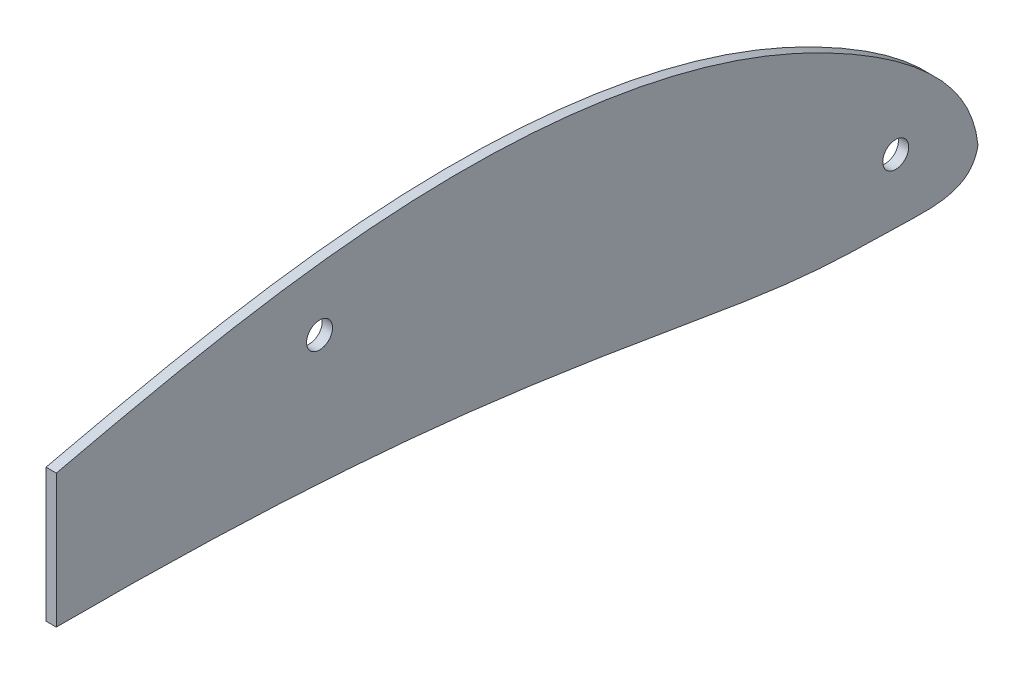
ISO-10303-21;
HEADER;
FILE_DESCRIPTION(('STEP AP214'),'2;1');
FILE_NAME('part.step','',(''),(''),'','','');
FILE_SCHEMA(('AUTOMOTIVE_DESIGN { 1 0 10303 214 1 1 1 1 }'));
ENDSEC;
DATA;
#1=APPLICATION_CONTEXT('core data for automotive mechanical design processes');
#2=APPLICATION_PROTOCOL_DEFINITION('international standard','automotive_design',2000,#1);
#3=PRODUCT_CONTEXT('',#1,'mechanical');
#4=PRODUCT('Part','Part','',(#3));
#5=PRODUCT_RELATED_PRODUCT_CATEGORY('part','',(#4));
#6=PRODUCT_DEFINITION_FORMATION('','',#4);
#7=PRODUCT_DEFINITION_CONTEXT('part definition',#1,'design');
#8=PRODUCT_DEFINITION('design','',#6,#7);
#9=PRODUCT_DEFINITION_SHAPE('','',#8);
#10=(LENGTH_UNIT() NAMED_UNIT(*) SI_UNIT(.MILLI.,.METRE.));
#11=(NAMED_UNIT(*) PLANE_ANGLE_UNIT() SI_UNIT($,.RADIAN.));
#12=(NAMED_UNIT(*) SI_UNIT($,.STERADIAN.) SOLID_ANGLE_UNIT());
#13=UNCERTAINTY_MEASURE_WITH_UNIT(LENGTH_MEASURE(1.E-05),#10,'distance_accuracy_value','');
#14=(GEOMETRIC_REPRESENTATION_CONTEXT(3) GLOBAL_UNCERTAINTY_ASSIGNED_CONTEXT((#13)) GLOBAL_UNIT_ASSIGNED_CONTEXT((#10,
#11,#12)) REPRESENTATION_CONTEXT('',''));
#15=CARTESIAN_POINT('',(0.,0.,0.));
#16=DIRECTION('',(0.,0.,1.));
#17=DIRECTION('',(1.,0.,0.));
#18=AXIS2_PLACEMENT_3D('',#15,#16,#17);
#19=CARTESIAN_POINT('',(-227.0125,249.356885044254,248.601164773977));
#20=DIRECTION('',(1.,0.,0.));
#21=DIRECTION('',(0.,1.,0.));
#22=AXIS2_PLACEMENT_3D('',#19,#20,#21);
#23=PLANE('',#22);
#24=CARTESIAN_POINT('',(-227.0125,10.9757958853986,70.5876602686386));
#25=DIRECTION('',(-1.,0.,0.));
#26=DIRECTION('',(0.,-1.,0.));
#27=AXIS2_PLACEMENT_3D('',#24,#25,#26);
#28=CIRCLE('',#27,2.);
#29=CARTESIAN_POINT('',(-227.0125,8.97579588539862,70.5876602686386));
#30=VERTEX_POINT('',#29);
#31=EDGE_CURVE('E614',#30,#30,#28,.T.);
#32=ORIENTED_EDGE('',*,*,#31,.T.);
#33=EDGE_LOOP('',(#32));
#34=FACE_BOUND('',#33,.T.);
#35=CARTESIAN_POINT('',(-227.0125,31.2957958853986,159.487660268639));
#36=DIRECTION('',(-1.,0.,0.));
#37=DIRECTION('',(0.,-1.,0.));
#38=AXIS2_PLACEMENT_3D('',#35,#36,#37);
#39=CIRCLE('',#38,2.);
#40=CARTESIAN_POINT('',(-227.0125,29.2957958853986,159.487660268639));
#41=VERTEX_POINT('',#40);
#42=EDGE_CURVE('E658',#41,#41,#39,.T.);
#43=ORIENTED_EDGE('',*,*,#42,.T.);
#44=EDGE_LOOP('',(#43));
#45=FACE_BOUND('',#44,.T.);
#46=CARTESIAN_POINT('',(-227.0125,5.89579588539861,57.8876602686386));
#47=CARTESIAN_POINT('',(-227.0125,11.4375298185041,58.4977039922272));
#48=CARTESIAN_POINT('',(-227.0125,19.3424786806868,64.4003558423215));
#49=CARTESIAN_POINT('',(-227.0125,28.468473074538,77.6824198998625));
#50=CARTESIAN_POINT('',(-227.0125,37.5748623123411,97.1285534265328));
#51=CARTESIAN_POINT('',(-227.0125,43.0194934329442,125.362969322304));
#52=CARTESIAN_POINT('',(-227.0125,41.5069186372436,169.207920796175));
#53=CARTESIAN_POINT('',(-227.0125,32.6348292698958,201.329645296342));
#54=CARTESIAN_POINT('',(-227.0125,28.067577517069,222.336628160291));
#55=B_SPLINE_CURVE_WITH_KNOTS('',3,(#46,#47,#48,#49,#50,#51,#52,#53,#54),.UNSPECIFIED.,.F.,.F.,
(4,1,1,1,1,1,4),(0.,0.0865869930935198,0.16173742787457,0.268322265449627,0.445156626621206,
0.638028872876503,1.),.UNSPECIFIED.);
#56=CARTESIAN_POINT('',(-227.0125,5.89579588539861,57.8876602686386));
#57=VERTEX_POINT('',#56);
#58=CARTESIAN_POINT('',(-227.0125,33.1564134447646,200.11162816029));
#59=VERTEX_POINT('',#58);
#60=EDGE_CURVE('E581',#57,#59,#55,.T.);
#61=ORIENTED_EDGE('',*,*,#60,.T.);
#62=DIRECTION('',(0.,-1.,0.));
#63=VECTOR('',#62,1.);
#64=CARTESIAN_POINT('',(-227.0125,-51.562025,200.11162816029));
#65=LINE('',#64,#63);
#66=CARTESIAN_POINT('',(-227.0125,12.5693808530336,200.11162816029));
#67=VERTEX_POINT('',#66);
#68=EDGE_CURVE('E617',#59,#67,#65,.T.);
#69=ORIENTED_EDGE('',*,*,#68,.T.);
#70=CARTESIAN_POINT('',(-227.0125,12.1750725821855,222.336628160268));
#71=CARTESIAN_POINT('',(-227.0125,13.0264646632632,193.680569664148));
#72=CARTESIAN_POINT('',(-227.0125,12.6013501035627,154.402001186683));
#73=CARTESIAN_POINT('',(-227.0125,5.45323272198308,107.967999962241));
#74=CARTESIAN_POINT('',(-227.0125,1.30332527226234,85.3393891083057));
#75=CARTESIAN_POINT('',(-227.0125,1.23503708265966,69.4212938685485));
#76=CARTESIAN_POINT('',(-227.0125,0.681560257657299,58.8140260385803));
#77=CARTESIAN_POINT('',(-227.0125,5.89579588539861,57.8876602686386));
#78=B_SPLINE_CURVE_WITH_KNOTS('',3,(#70,#71,#72,#73,#74,#75,#76,#77),.UNSPECIFIED.,.F.,.F.,(4,1,
1,1,1,4),(0.,0.517329721776624,0.696666541434988,0.84940993817877,0.919519723249622,1.),.UNSPECIFIED.);
#79=EDGE_CURVE('E684',#67,#57,#78,.T.);
#80=ORIENTED_EDGE('',*,*,#79,.T.);
#81=EDGE_LOOP('',(#61,#69,#80));
#82=FACE_BOUND('',#81,.T.);
#83=ADVANCED_FACE('F563',(#34,#45,#82),#23,.T.);
#84=CARTESIAN_POINT('',(-228.6,57.38803834214,248.601164773977));
#85=DIRECTION('',(-1.,0.,0.));
#86=DIRECTION('',(0.,-1.,0.));
#87=AXIS2_PLACEMENT_3D('',#84,#85,#86);
#88=PLANE('',#87);
#89=CARTESIAN_POINT('',(-228.6,10.9757958853986,70.5876602686386));
#90=DIRECTION('',(-1.,0.,0.));
#91=DIRECTION('',(0.,-1.,0.));
#92=AXIS2_PLACEMENT_3D('',#89,#90,#91);
#93=CIRCLE('',#92,2.);
#94=CARTESIAN_POINT('',(-228.6,8.97579588539862,70.5876602686386));
#95=VERTEX_POINT('',#94);
#96=EDGE_CURVE('E656',#95,#95,#93,.T.);
#97=ORIENTED_EDGE('',*,*,#96,.F.);
#98=EDGE_LOOP('',(#97));
#99=FACE_BOUND('',#98,.T.);
#100=CARTESIAN_POINT('',(-228.6,31.2957958853986,159.487660268639));
#101=DIRECTION('',(-1.,0.,0.));
#102=DIRECTION('',(0.,-1.,0.));
#103=AXIS2_PLACEMENT_3D('',#100,#101,#102);
#104=CIRCLE('',#103,2.);
#105=CARTESIAN_POINT('',(-228.6,29.2957958853986,159.487660268639));
#106=VERTEX_POINT('',#105);
#107=EDGE_CURVE('E664',#106,#106,#104,.T.);
#108=ORIENTED_EDGE('',*,*,#107,.F.);
#109=EDGE_LOOP('',(#108));
#110=FACE_BOUND('',#109,.T.);
#111=CARTESIAN_POINT('',(-228.6,12.1750725821855,222.336628160268));
#112=CARTESIAN_POINT('',(-228.6,13.0264646632632,193.680569664148));
#113=CARTESIAN_POINT('',(-228.6,12.6013501035627,154.402001186683));
#114=CARTESIAN_POINT('',(-228.6,5.45323272198308,107.967999962241));
#115=CARTESIAN_POINT('',(-228.6,1.30332527226234,85.3393891083057));
#116=CARTESIAN_POINT('',(-228.6,1.23503708265966,69.4212938685485));
#117=CARTESIAN_POINT('',(-228.6,0.681560257657299,58.8140260385803));
#118=CARTESIAN_POINT('',(-228.6,5.89579588539861,57.8876602686386));
#119=B_SPLINE_CURVE_WITH_KNOTS('',3,(#111,#112,#113,#114,#115,#116,#117,#118),.UNSPECIFIED.,.F.,
.F.,(4,1,1,1,1,4),(0.,0.517329721776624,0.696666541434988,0.84940993817877,0.919519723249622,
1.),.UNSPECIFIED.);
#120=CARTESIAN_POINT('',(-228.6,5.89579588539861,57.8876602686386));
#121=VERTEX_POINT('',#120);
#122=CARTESIAN_POINT('',(-228.6,12.5693808530336,200.11162816029));
#123=VERTEX_POINT('',#122);
#124=EDGE_CURVE('E589',#121,#123,#119,.F.);
#125=ORIENTED_EDGE('',*,*,#124,.T.);
#126=DIRECTION('',(0.,1.,0.));
#127=VECTOR('',#126,1.);
#128=CARTESIAN_POINT('',(-228.6,-51.562025,200.11162816029));
#129=LINE('',#128,#127);
#130=CARTESIAN_POINT('',(-228.6,33.1564134447646,200.11162816029));
#131=VERTEX_POINT('',#130);
#132=EDGE_CURVE('E598',#123,#131,#129,.T.);
#133=ORIENTED_EDGE('',*,*,#132,.T.);
#134=CARTESIAN_POINT('',(-228.6,5.89579588539861,57.8876602686386));
#135=CARTESIAN_POINT('',(-228.6,11.4375298185041,58.4977039922272));
#136=CARTESIAN_POINT('',(-228.6,19.3424786806868,64.4003558423215));
#137=CARTESIAN_POINT('',(-228.6,28.468473074538,77.6824198998625));
#138=CARTESIAN_POINT('',(-228.6,37.5748623123411,97.1285534265328));
#139=CARTESIAN_POINT('',(-228.6,43.0194934329442,125.362969322304));
#140=CARTESIAN_POINT('',(-228.6,41.5069186372436,169.207920796175));
#141=CARTESIAN_POINT('',(-228.6,32.6348292698958,201.329645296342));
#142=CARTESIAN_POINT('',(-228.6,28.067577517069,222.336628160291));
#143=B_SPLINE_CURVE_WITH_KNOTS('',3,(#134,#135,#136,#137,#138,#139,#140,#141,#142),
.UNSPECIFIED.,.F.,.F.,(4,1,1,1,1,1,4),(0.,0.0865869930935198,0.16173742787457,0.268322265449627,
0.445156626621206,0.638028872876503,1.),.UNSPECIFIED.);
#144=EDGE_CURVE('E601',#131,#121,#143,.F.);
#145=ORIENTED_EDGE('',*,*,#144,.T.);
#146=EDGE_LOOP('',(#125,#133,#145));
#147=FACE_BOUND('',#146,.T.);
#148=ADVANCED_FACE('F600',(#99,#110,#147),#88,.T.);
#149=CARTESIAN_POINT('',(51.564,5.89579588539861,57.8876602686386));
#150=CARTESIAN_POINT('',(51.564,11.4375298185041,58.4977039922272));
#151=CARTESIAN_POINT('',(51.564,19.3424786806868,64.4003558423215));
#152=CARTESIAN_POINT('',(51.564,28.468473074538,77.6824198998625));
#153=CARTESIAN_POINT('',(51.564,37.5748623123411,97.1285534265328));
#154=CARTESIAN_POINT('',(51.564,43.0194934329442,125.362969322304));
#155=CARTESIAN_POINT('',(51.564,41.5069186372436,169.207920796175));
#156=CARTESIAN_POINT('',(51.564,32.6348292698958,201.329645296342));
#157=CARTESIAN_POINT('',(51.564,28.067577517069,222.336628160291));
#158=B_SPLINE_CURVE_WITH_KNOTS('',3,(#149,#150,#151,#152,#153,#154,#155,#156,#157),
.UNSPECIFIED.,.F.,.F.,(4,1,1,1,1,1,4),(0.,0.0865869930935198,0.16173742787457,0.268322265449627,
0.445156626621206,0.638028872876503,1.),.UNSPECIFIED.);
#159=DIRECTION('',(-1.,0.,0.));
#160=VECTOR('',#159,1.);
#161=SURFACE_OF_LINEAR_EXTRUSION('',#158,#160);
#162=ORIENTED_EDGE('',*,*,#144,.F.);
#163=DIRECTION('',(-1.,0.,0.));
#164=VECTOR('',#163,1.);
#165=CARTESIAN_POINT('',(-139.184088057034,33.1564134447646,200.11162816029));
#166=LINE('',#165,#164);
#167=EDGE_CURVE('E606',#131,#59,#166,.F.);
#168=ORIENTED_EDGE('',*,*,#167,.T.);
#169=ORIENTED_EDGE('',*,*,#60,.F.);
#170=DIRECTION('',(-1.,0.,0.));
#171=VECTOR('',#170,1.);
#172=CARTESIAN_POINT('',(51.564,5.89579588539861,57.8876602686386));
#173=LINE('',#172,#171);
#174=EDGE_CURVE('E568',#57,#121,#173,.T.);
#175=ORIENTED_EDGE('',*,*,#174,.T.);
#176=EDGE_LOOP('',(#162,#168,#169,#175));
#177=FACE_BOUND('',#176,.T.);
#178=ADVANCED_FACE('F611',(#177),#161,.F.);
#179=CARTESIAN_POINT('',(51.564,12.1750725821855,222.336628160268));
#180=CARTESIAN_POINT('',(51.564,13.0264646632632,193.680569664148));
#181=CARTESIAN_POINT('',(51.564,12.6013501035627,154.402001186683));
#182=CARTESIAN_POINT('',(51.564,5.45323272198308,107.967999962241));
#183=CARTESIAN_POINT('',(51.564,1.30332527226234,85.3393891083057));
#184=CARTESIAN_POINT('',(51.564,1.23503708265966,69.4212938685485));
#185=CARTESIAN_POINT('',(51.564,0.681560257657299,58.8140260385803));
#186=CARTESIAN_POINT('',(51.564,5.89579588539861,57.8876602686386));
#187=B_SPLINE_CURVE_WITH_KNOTS('',3,(#179,#180,#181,#182,#183,#184,#185,#186),.UNSPECIFIED.,.F.,
.F.,(4,1,1,1,1,4),(0.,0.517329721776624,0.696666541434988,0.84940993817877,0.919519723249622,
1.),.UNSPECIFIED.);
#188=DIRECTION('',(-1.,0.,0.));
#189=VECTOR('',#188,1.);
#190=SURFACE_OF_LINEAR_EXTRUSION('',#187,#189);
#191=ORIENTED_EDGE('',*,*,#124,.F.);
#192=ORIENTED_EDGE('',*,*,#174,.F.);
#193=ORIENTED_EDGE('',*,*,#79,.F.);
#194=DIRECTION('',(-1.,0.,0.));
#195=VECTOR('',#194,1.);
#196=CARTESIAN_POINT('',(-139.332644031338,12.5693808530336,200.11162816029));
#197=LINE('',#196,#195);
#198=EDGE_CURVE('E12',#67,#123,#197,.T.);
#199=ORIENTED_EDGE('',*,*,#198,.T.);
#200=EDGE_LOOP('',(#191,#192,#193,#199));
#201=FACE_BOUND('',#200,.T.);
#202=ADVANCED_FACE('F565',(#201),#190,.F.);
#203=CARTESIAN_POINT('',(-50.8000000000002,-51.562025,200.11162816029));
#204=DIRECTION('',(0.,0.,-1.));
#205=DIRECTION('',(0.,1.,0.));
#206=AXIS2_PLACEMENT_3D('',#203,#204,#205);
#207=PLANE('',#206);
#208=ORIENTED_EDGE('',*,*,#68,.F.);
#209=ORIENTED_EDGE('',*,*,#167,.F.);
#210=ORIENTED_EDGE('',*,*,#132,.F.);
#211=ORIENTED_EDGE('',*,*,#198,.F.);
#212=EDGE_LOOP('',(#208,#209,#210,#211));
#213=FACE_BOUND('',#212,.T.);
#214=ADVANCED_FACE('F616',(#213),#207,.F.);
#215=CARTESIAN_POINT('',(-227.0125,31.2957958853986,159.487660268639));
#216=DIRECTION('',(-1.,0.,0.));
#217=DIRECTION('',(0.,-1.,0.));
#218=AXIS2_PLACEMENT_3D('',#215,#216,#217);
#219=CYLINDRICAL_SURFACE('',#218,2.);
#220=CARTESIAN_POINT('',(-227.0125,29.2957958853986,159.487660268639));
#221=CARTESIAN_POINT('',(-227.029036458333,29.2957958853986,159.487660268639));
#222=CARTESIAN_POINT('',(-227.045572916667,29.2957958853986,159.487660268639));
#223=CARTESIAN_POINT('',(-227.078645833333,29.2957958853986,159.487660268639));
#224=CARTESIAN_POINT('',(-227.095182291667,29.2957958853986,159.487660268639));
#225=CARTESIAN_POINT('',(-227.128255208333,29.2957958853986,159.487660268639));
#226=CARTESIAN_POINT('',(-227.144791666667,29.2957958853986,159.487660268639));
#227=CARTESIAN_POINT('',(-227.177864583333,29.2957958853986,159.487660268639));
#228=CARTESIAN_POINT('',(-227.194401041667,29.2957958853986,159.487660268639));
#229=CARTESIAN_POINT('',(-227.227473958333,29.2957958853986,159.487660268639));
#230=CARTESIAN_POINT('',(-227.244010416667,29.2957958853986,159.487660268639));
#231=CARTESIAN_POINT('',(-227.277083333333,29.2957958853986,159.487660268639));
#232=CARTESIAN_POINT('',(-227.293619791667,29.2957958853986,159.487660268639));
#233=CARTESIAN_POINT('',(-227.326692708333,29.2957958853986,159.487660268639));
#234=CARTESIAN_POINT('',(-227.343229166667,29.2957958853986,159.487660268639));
#235=CARTESIAN_POINT('',(-227.376302083333,29.2957958853986,159.487660268639));
#236=CARTESIAN_POINT('',(-227.392838541667,29.2957958853986,159.487660268639));
#237=CARTESIAN_POINT('',(-227.425911458333,29.2957958853986,159.487660268639));
#238=CARTESIAN_POINT('',(-227.442447916667,29.2957958853986,159.487660268639));
#239=CARTESIAN_POINT('',(-227.475520833333,29.2957958853986,159.487660268639));
#240=CARTESIAN_POINT('',(-227.492057291667,29.2957958853986,159.487660268639));
#241=CARTESIAN_POINT('',(-227.525130208333,29.2957958853986,159.487660268639));
#242=CARTESIAN_POINT('',(-227.541666666667,29.2957958853986,159.487660268639));
#243=CARTESIAN_POINT('',(-227.574739583333,29.2957958853986,159.487660268639));
#244=CARTESIAN_POINT('',(-227.591276041667,29.2957958853986,159.487660268639));
#245=CARTESIAN_POINT('',(-227.624348958333,29.2957958853986,159.487660268639));
#246=CARTESIAN_POINT('',(-227.640885416667,29.2957958853986,159.487660268639));
#247=CARTESIAN_POINT('',(-227.673958333333,29.2957958853986,159.487660268639));
#248=CARTESIAN_POINT('',(-227.690494791667,29.2957958853986,159.487660268639));
#249=CARTESIAN_POINT('',(-227.723567708333,29.2957958853986,159.487660268639));
#250=CARTESIAN_POINT('',(-227.740104166667,29.2957958853986,159.487660268639));
#251=CARTESIAN_POINT('',(-227.773177083333,29.2957958853986,159.487660268639));
#252=CARTESIAN_POINT('',(-227.789713541667,29.2957958853986,159.487660268639));
#253=CARTESIAN_POINT('',(-227.822786458333,29.2957958853986,159.487660268639));
#254=CARTESIAN_POINT('',(-227.839322916667,29.2957958853986,159.487660268639));
#255=CARTESIAN_POINT('',(-227.872395833333,29.2957958853986,159.487660268639));
#256=CARTESIAN_POINT('',(-227.888932291667,29.2957958853986,159.487660268639));
#257=CARTESIAN_POINT('',(-227.922005208333,29.2957958853986,159.487660268639));
#258=CARTESIAN_POINT('',(-227.938541666667,29.2957958853986,159.487660268639));
#259=CARTESIAN_POINT('',(-227.971614583333,29.2957958853986,159.487660268639));
#260=CARTESIAN_POINT('',(-227.988151041667,29.2957958853986,159.487660268639));
#261=CARTESIAN_POINT('',(-228.021223958333,29.2957958853986,159.487660268639));
#262=CARTESIAN_POINT('',(-228.037760416667,29.2957958853986,159.487660268639));
#263=CARTESIAN_POINT('',(-228.070833333333,29.2957958853986,159.487660268639));
#264=CARTESIAN_POINT('',(-228.087369791667,29.2957958853986,159.487660268639));
#265=CARTESIAN_POINT('',(-228.120442708333,29.2957958853986,159.487660268639));
#266=CARTESIAN_POINT('',(-228.136979166667,29.2957958853986,159.487660268639));
#267=CARTESIAN_POINT('',(-228.170052083333,29.2957958853986,159.487660268639));
#268=CARTESIAN_POINT('',(-228.186588541667,29.2957958853986,159.487660268639));
#269=CARTESIAN_POINT('',(-228.219661458333,29.2957958853986,159.487660268639));
#270=CARTESIAN_POINT('',(-228.236197916667,29.2957958853986,159.487660268639));
#271=CARTESIAN_POINT('',(-228.269270833333,29.2957958853986,159.487660268639));
#272=CARTESIAN_POINT('',(-228.285807291667,29.2957958853986,159.487660268639));
#273=CARTESIAN_POINT('',(-228.318880208333,29.2957958853986,159.487660268639));
#274=CARTESIAN_POINT('',(-228.335416666667,29.2957958853986,159.487660268639));
#275=CARTESIAN_POINT('',(-228.368489583333,29.2957958853986,159.487660268639));
#276=CARTESIAN_POINT('',(-228.385026041667,29.2957958853986,159.487660268639));
#277=CARTESIAN_POINT('',(-228.418098958333,29.2957958853986,159.487660268639));
#278=CARTESIAN_POINT('',(-228.434635416667,29.2957958853986,159.487660268639));
#279=CARTESIAN_POINT('',(-228.467708333333,29.2957958853986,159.487660268639));
#280=CARTESIAN_POINT('',(-228.484244791667,29.2957958853986,159.487660268639));
#281=CARTESIAN_POINT('',(-228.517317708333,29.2957958853986,159.487660268639));
#282=CARTESIAN_POINT('',(-228.533854166667,29.2957958853986,159.487660268639));
#283=CARTESIAN_POINT('',(-228.566927083333,29.2957958853986,159.487660268639));
#284=CARTESIAN_POINT('',(-228.583463541667,29.2957958853986,159.487660268639));
#285=CARTESIAN_POINT('',(-228.6,29.2957958853986,159.487660268639));
#286=B_SPLINE_CURVE_WITH_KNOTS('',3,(#220,#221,#222,#223,#224,#225,#226,#227,#228,#229,#230,
#231,#232,#233,#234,#235,#236,#237,#238,#239,#240,#241,#242,#243,#244,#245,#246,#247,#248,#249,
#250,#251,#252,#253,#254,#255,#256,#257,#258,#259,#260,#261,#262,#263,#264,#265,#266,#267,#268,
#269,#270,#271,#272,#273,#274,#275,#276,#277,#278,#279,#280,#281,#282,#283,#284,#285),
.UNSPECIFIED.,.F.,.F.,(4,2,2,2,2,2,2,2,2,2,2,2,2,2,2,2,2,2,2,2,2,2,2,2,2,2,2,2,2,2,2,2,4),(0.,
0.0496093749999815,0.0992187499999908,0.148828124999972,0.198437499999982,0.248046874999991,
0.297656249999972,0.347265624999982,0.396874999999991,0.446484374999973,0.496093749999982,
0.545703124999991,0.595312499999973,0.644921874999982,0.694531249999991,0.744140624999973,
0.793749999999982,0.843359374999991,0.892968749999973,0.942578124999982,0.992187499999991,
1.04179687499997,1.09140624999998,1.14101562499999,1.19062499999997,1.24023437499998,
1.28984374999999,1.33945312499997,1.38906249999998,1.43867187499999,1.48828124999997,
1.53789062499998,1.58749999999999),.UNSPECIFIED.);
#287=EDGE_CURVE('BSEAM636',#41,#106,#286,.T.);
#288=ORIENTED_EDGE('',*,*,#42,.F.);
#289=ORIENTED_EDGE('',*,*,#107,.T.);
#290=ORIENTED_EDGE('',*,*,#287,.T.);
#291=ORIENTED_EDGE('',*,*,#287,.F.);
#292=EDGE_LOOP('',(#288,#290,#289,#291));
#293=FACE_BOUND('',#292,.T.);
#294=ADVANCED_FACE('F636',(#293),#219,.F.);
#295=CARTESIAN_POINT('',(-227.0125,10.9757958853986,70.5876602686386));
#296=DIRECTION('',(-1.,0.,0.));
#297=DIRECTION('',(0.,-1.,0.));
#298=AXIS2_PLACEMENT_3D('',#295,#296,#297);
#299=CYLINDRICAL_SURFACE('',#298,2.);
#300=CARTESIAN_POINT('',(-227.0125,8.97579588539862,70.5876602686386));
#301=CARTESIAN_POINT('',(-227.029036458333,8.97579588539862,70.5876602686386));
#302=CARTESIAN_POINT('',(-227.045572916667,8.97579588539862,70.5876602686386));
#303=CARTESIAN_POINT('',(-227.078645833333,8.97579588539862,70.5876602686386));
#304=CARTESIAN_POINT('',(-227.095182291667,8.97579588539862,70.5876602686386));
#305=CARTESIAN_POINT('',(-227.128255208333,8.97579588539862,70.5876602686386));
#306=CARTESIAN_POINT('',(-227.144791666667,8.97579588539862,70.5876602686386));
#307=CARTESIAN_POINT('',(-227.177864583333,8.97579588539862,70.5876602686386));
#308=CARTESIAN_POINT('',(-227.194401041667,8.97579588539862,70.5876602686386));
#309=CARTESIAN_POINT('',(-227.227473958333,8.97579588539862,70.5876602686386));
#310=CARTESIAN_POINT('',(-227.244010416667,8.97579588539862,70.5876602686386));
#311=CARTESIAN_POINT('',(-227.277083333333,8.97579588539862,70.5876602686386));
#312=CARTESIAN_POINT('',(-227.293619791667,8.97579588539862,70.5876602686386));
#313=CARTESIAN_POINT('',(-227.326692708333,8.97579588539862,70.5876602686386));
#314=CARTESIAN_POINT('',(-227.343229166667,8.97579588539862,70.5876602686386));
#315=CARTESIAN_POINT('',(-227.376302083333,8.97579588539862,70.5876602686386));
#316=CARTESIAN_POINT('',(-227.392838541667,8.97579588539862,70.5876602686386));
#317=CARTESIAN_POINT('',(-227.425911458333,8.97579588539862,70.5876602686386));
#318=CARTESIAN_POINT('',(-227.442447916667,8.97579588539862,70.5876602686386));
#319=CARTESIAN_POINT('',(-227.475520833333,8.97579588539862,70.5876602686386));
#320=CARTESIAN_POINT('',(-227.492057291667,8.97579588539862,70.5876602686386));
#321=CARTESIAN_POINT('',(-227.525130208333,8.97579588539862,70.5876602686386));
#322=CARTESIAN_POINT('',(-227.541666666667,8.97579588539862,70.5876602686386));
#323=CARTESIAN_POINT('',(-227.574739583333,8.97579588539862,70.5876602686386));
#324=CARTESIAN_POINT('',(-227.591276041667,8.97579588539862,70.5876602686386));
#325=CARTESIAN_POINT('',(-227.624348958333,8.97579588539862,70.5876602686386));
#326=CARTESIAN_POINT('',(-227.640885416667,8.97579588539862,70.5876602686386));
#327=CARTESIAN_POINT('',(-227.673958333333,8.97579588539862,70.5876602686386));
#328=CARTESIAN_POINT('',(-227.690494791667,8.97579588539862,70.5876602686386));
#329=CARTESIAN_POINT('',(-227.723567708333,8.97579588539862,70.5876602686386));
#330=CARTESIAN_POINT('',(-227.740104166667,8.97579588539862,70.5876602686386));
#331=CARTESIAN_POINT('',(-227.773177083333,8.97579588539862,70.5876602686386));
#332=CARTESIAN_POINT('',(-227.789713541667,8.97579588539862,70.5876602686386));
#333=CARTESIAN_POINT('',(-227.822786458333,8.97579588539862,70.5876602686386));
#334=CARTESIAN_POINT('',(-227.839322916667,8.97579588539862,70.5876602686386));
#335=CARTESIAN_POINT('',(-227.872395833333,8.97579588539862,70.5876602686386));
#336=CARTESIAN_POINT('',(-227.888932291667,8.97579588539862,70.5876602686386));
#337=CARTESIAN_POINT('',(-227.922005208333,8.97579588539862,70.5876602686386));
#338=CARTESIAN_POINT('',(-227.938541666667,8.97579588539862,70.5876602686386));
#339=CARTESIAN_POINT('',(-227.971614583333,8.97579588539862,70.5876602686386));
#340=CARTESIAN_POINT('',(-227.988151041667,8.97579588539862,70.5876602686386));
#341=CARTESIAN_POINT('',(-228.021223958333,8.97579588539862,70.5876602686386));
#342=CARTESIAN_POINT('',(-228.037760416667,8.97579588539862,70.5876602686386));
#343=CARTESIAN_POINT('',(-228.070833333333,8.97579588539862,70.5876602686386));
#344=CARTESIAN_POINT('',(-228.087369791667,8.97579588539862,70.5876602686386));
#345=CARTESIAN_POINT('',(-228.120442708333,8.97579588539862,70.5876602686386));
#346=CARTESIAN_POINT('',(-228.136979166667,8.97579588539862,70.5876602686386));
#347=CARTESIAN_POINT('',(-228.170052083333,8.97579588539862,70.5876602686386));
#348=CARTESIAN_POINT('',(-228.186588541667,8.97579588539862,70.5876602686386));
#349=CARTESIAN_POINT('',(-228.219661458333,8.97579588539862,70.5876602686386));
#350=CARTESIAN_POINT('',(-228.236197916667,8.97579588539862,70.5876602686386));
#351=CARTESIAN_POINT('',(-228.269270833333,8.97579588539862,70.5876602686386));
#352=CARTESIAN_POINT('',(-228.285807291667,8.97579588539862,70.5876602686386));
#353=CARTESIAN_POINT('',(-228.318880208333,8.97579588539862,70.5876602686386));
#354=CARTESIAN_POINT('',(-228.335416666667,8.97579588539862,70.5876602686386));
#355=CARTESIAN_POINT('',(-228.368489583333,8.97579588539862,70.5876602686386));
#356=CARTESIAN_POINT('',(-228.385026041667,8.97579588539862,70.5876602686386));
#357=CARTESIAN_POINT('',(-228.418098958333,8.97579588539862,70.5876602686386));
#358=CARTESIAN_POINT('',(-228.434635416667,8.97579588539862,70.5876602686386));
#359=CARTESIAN_POINT('',(-228.467708333333,8.97579588539862,70.5876602686386));
#360=CARTESIAN_POINT('',(-228.484244791667,8.97579588539862,70.5876602686386));
#361=CARTESIAN_POINT('',(-228.517317708333,8.97579588539862,70.5876602686386));
#362=CARTESIAN_POINT('',(-228.533854166667,8.97579588539862,70.5876602686386));
#363=CARTESIAN_POINT('',(-228.566927083333,8.97579588539862,70.5876602686386));
#364=CARTESIAN_POINT('',(-228.583463541667,8.97579588539862,70.5876602686386));
#365=CARTESIAN_POINT('',(-228.6,8.97579588539862,70.5876602686386));
#366=B_SPLINE_CURVE_WITH_KNOTS('',3,(#300,#301,#302,#303,#304,#305,#306,#307,#308,#309,#310,
#311,#312,#313,#314,#315,#316,#317,#318,#319,#320,#321,#322,#323,#324,#325,#326,#327,#328,#329,
#330,#331,#332,#333,#334,#335,#336,#337,#338,#339,#340,#341,#342,#343,#344,#345,#346,#347,#348,
#349,#350,#351,#352,#353,#354,#355,#356,#357,#358,#359,#360,#361,#362,#363,#364,#365),
.UNSPECIFIED.,.F.,.F.,(4,2,2,2,2,2,2,2,2,2,2,2,2,2,2,2,2,2,2,2,2,2,2,2,2,2,2,2,2,2,2,2,4),(0.,
0.0496093749999815,0.0992187499999908,0.148828124999972,0.198437499999982,0.248046874999991,
0.297656249999972,0.347265624999982,0.396874999999991,0.446484374999973,0.496093749999982,
0.545703124999991,0.595312499999973,0.644921874999982,0.694531249999991,0.744140624999973,
0.793749999999982,0.843359374999991,0.892968749999973,0.942578124999982,0.992187499999991,
1.04179687499997,1.09140624999998,1.14101562499999,1.19062499999997,1.24023437499998,
1.28984374999999,1.33945312499997,1.38906249999998,1.43867187499999,1.48828124999997,
1.53789062499998,1.58749999999999),.UNSPECIFIED.);
#367=EDGE_CURVE('BSEAM645',#30,#95,#366,.T.);
#368=ORIENTED_EDGE('',*,*,#31,.F.);
#369=ORIENTED_EDGE('',*,*,#96,.T.);
#370=ORIENTED_EDGE('',*,*,#367,.T.);
#371=ORIENTED_EDGE('',*,*,#367,.F.);
#372=EDGE_LOOP('',(#368,#370,#369,#371));
#373=FACE_BOUND('',#372,.T.);
#374=ADVANCED_FACE('F645',(#373),#299,.F.);
#375=CLOSED_SHELL('',(#83,#148,#178,#202,#214,#294,#374));
#376=MANIFOLD_SOLID_BREP('B2',#375);
#377=ADVANCED_BREP_SHAPE_REPRESENTATION('',(#18,#376),#14);
#378=SHAPE_DEFINITION_REPRESENTATION(#9,#377);
ENDSEC;
END-ISO-10303-21;
